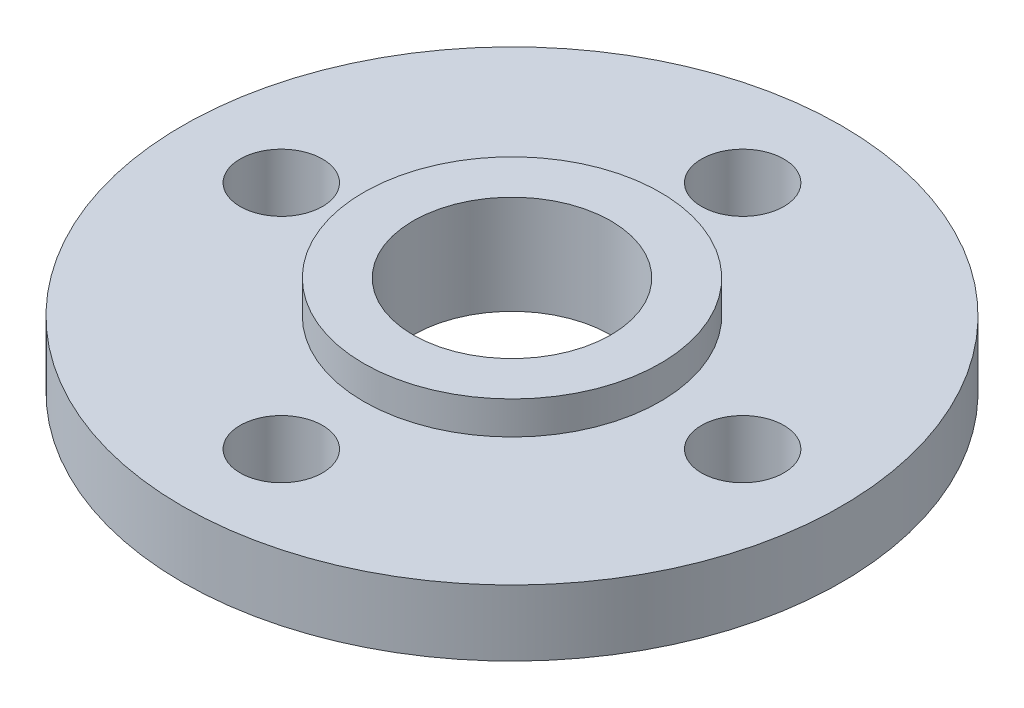
ISO-10303-21;
HEADER;
FILE_DESCRIPTION(('STEP AP214'),'2;1');
FILE_NAME('part.step','',(''),(''),'','','');
FILE_SCHEMA(('AUTOMOTIVE_DESIGN { 1 0 10303 214 1 1 1 1 }'));
ENDSEC;
DATA;
#1=APPLICATION_CONTEXT('core data for automotive mechanical design processes');
#2=APPLICATION_PROTOCOL_DEFINITION('international standard','automotive_design',2000,#1);
#3=PRODUCT_CONTEXT('',#1,'mechanical');
#4=PRODUCT('Part','Part','',(#3));
#5=PRODUCT_RELATED_PRODUCT_CATEGORY('part','',(#4));
#6=PRODUCT_DEFINITION_FORMATION('','',#4);
#7=PRODUCT_DEFINITION_CONTEXT('part definition',#1,'design');
#8=PRODUCT_DEFINITION('design','',#6,#7);
#9=PRODUCT_DEFINITION_SHAPE('','',#8);
#10=(LENGTH_UNIT() NAMED_UNIT(*) SI_UNIT(.MILLI.,.METRE.));
#11=(NAMED_UNIT(*) PLANE_ANGLE_UNIT() SI_UNIT($,.RADIAN.));
#12=(NAMED_UNIT(*) SI_UNIT($,.STERADIAN.) SOLID_ANGLE_UNIT());
#13=UNCERTAINTY_MEASURE_WITH_UNIT(LENGTH_MEASURE(1.E-05),#10,'distance_accuracy_value','');
#14=(GEOMETRIC_REPRESENTATION_CONTEXT(3) GLOBAL_UNCERTAINTY_ASSIGNED_CONTEXT((#13)) GLOBAL_UNIT_ASSIGNED_CONTEXT((#10,
#11,#12)) REPRESENTATION_CONTEXT('',''));
#15=CARTESIAN_POINT('',(0.,0.,0.));
#16=DIRECTION('',(0.,0.,1.));
#17=DIRECTION('',(1.,0.,0.));
#18=AXIS2_PLACEMENT_3D('',#15,#16,#17);
#19=CARTESIAN_POINT('',(0.,2.,0.));
#20=DIRECTION('',(0.,1.,0.));
#21=DIRECTION('',(0.,0.,1.));
#22=AXIS2_PLACEMENT_3D('',#19,#20,#21);
#23=PLANE('',#22);
#24=CARTESIAN_POINT('',(0.,2.,-7.));
#25=DIRECTION('',(0.,1.,0.));
#26=DIRECTION('',(0.,0.,1.));
#27=AXIS2_PLACEMENT_3D('',#24,#25,#26);
#28=CIRCLE('',#27,1.25);
#29=CARTESIAN_POINT('',(0.,2.,-5.75));
#30=VERTEX_POINT('',#29);
#31=EDGE_CURVE('E63',#30,#30,#28,.T.);
#32=ORIENTED_EDGE('',*,*,#31,.F.);
#33=EDGE_LOOP('',(#32));
#34=FACE_BOUND('',#33,.T.);
#35=CARTESIAN_POINT('',(0.,2.,7.));
#36=DIRECTION('',(0.,1.,0.));
#37=DIRECTION('',(0.,0.,1.));
#38=AXIS2_PLACEMENT_3D('',#35,#36,#37);
#39=CIRCLE('',#38,1.25);
#40=CARTESIAN_POINT('',(0.,2.,8.25));
#41=VERTEX_POINT('',#40);
#42=EDGE_CURVE('E53',#41,#41,#39,.T.);
#43=ORIENTED_EDGE('',*,*,#42,.F.);
#44=EDGE_LOOP('',(#43));
#45=FACE_BOUND('',#44,.T.);
#46=CARTESIAN_POINT('',(7.,2.,0.));
#47=DIRECTION('',(0.,1.,0.));
#48=DIRECTION('',(0.,0.,1.));
#49=AXIS2_PLACEMENT_3D('',#46,#47,#48);
#50=CIRCLE('',#49,1.25);
#51=CARTESIAN_POINT('',(7.,2.,1.25));
#52=VERTEX_POINT('',#51);
#53=EDGE_CURVE('E43',#52,#52,#50,.T.);
#54=ORIENTED_EDGE('',*,*,#53,.F.);
#55=EDGE_LOOP('',(#54));
#56=FACE_BOUND('',#55,.T.);
#57=CARTESIAN_POINT('',(0.,2.,0.));
#58=DIRECTION('',(0.,1.,0.));
#59=DIRECTION('',(0.,0.,1.));
#60=AXIS2_PLACEMENT_3D('',#57,#58,#59);
#61=CIRCLE('',#60,10.);
#62=CARTESIAN_POINT('',(0.,2.,10.));
#63=VERTEX_POINT('',#62);
#64=EDGE_CURVE('E10',#63,#63,#61,.T.);
#65=ORIENTED_EDGE('',*,*,#64,.T.);
#66=EDGE_LOOP('',(#65));
#67=FACE_BOUND('',#66,.T.);
#68=CARTESIAN_POINT('',(-7.,2.,0.));
#69=DIRECTION('',(0.,1.,0.));
#70=DIRECTION('',(0.,0.,1.));
#71=AXIS2_PLACEMENT_3D('',#68,#69,#70);
#72=CIRCLE('',#71,1.25);
#73=CARTESIAN_POINT('',(-7.,2.,1.24999999999995));
#74=VERTEX_POINT('',#73);
#75=EDGE_CURVE('E57',#74,#74,#72,.T.);
#76=ORIENTED_EDGE('',*,*,#75,.F.);
#77=EDGE_LOOP('',(#76));
#78=FACE_BOUND('',#77,.T.);
#79=CARTESIAN_POINT('',(0.,2.,0.));
#80=DIRECTION('',(0.,1.,0.));
#81=DIRECTION('',(0.,0.,1.));
#82=AXIS2_PLACEMENT_3D('',#79,#80,#81);
#83=CIRCLE('',#82,4.5);
#84=CARTESIAN_POINT('',(0.,2.,4.5));
#85=VERTEX_POINT('',#84);
#86=EDGE_CURVE('E72',#85,#85,#83,.T.);
#87=ORIENTED_EDGE('',*,*,#86,.F.);
#88=EDGE_LOOP('',(#87));
#89=FACE_BOUND('',#88,.T.);
#90=ADVANCED_FACE('F32',(#34,#45,#56,#67,#78,#89),#23,.T.);
#91=CARTESIAN_POINT('',(0.,0.,0.));
#92=DIRECTION('',(0.,1.,0.));
#93=DIRECTION('',(0.,0.,1.));
#94=AXIS2_PLACEMENT_3D('',#91,#92,#93);
#95=PLANE('',#94);
#96=CARTESIAN_POINT('',(-7.,0.,0.));
#97=DIRECTION('',(0.,1.,0.));
#98=DIRECTION('',(0.,0.,1.));
#99=AXIS2_PLACEMENT_3D('',#96,#97,#98);
#100=CIRCLE('',#99,1.25);
#101=CARTESIAN_POINT('',(-7.,0.,1.24999999999995));
#102=VERTEX_POINT('',#101);
#103=EDGE_CURVE('E60',#102,#102,#100,.T.);
#104=ORIENTED_EDGE('',*,*,#103,.T.);
#105=EDGE_LOOP('',(#104));
#106=FACE_BOUND('',#105,.T.);
#107=CARTESIAN_POINT('',(0.,0.,0.));
#108=DIRECTION('',(0.,1.,0.));
#109=DIRECTION('',(0.,0.,1.));
#110=AXIS2_PLACEMENT_3D('',#107,#108,#109);
#111=CIRCLE('',#110,3.);
#112=CARTESIAN_POINT('',(0.,0.,3.));
#113=VERTEX_POINT('',#112);
#114=EDGE_CURVE('E48',#113,#113,#111,.T.);
#115=ORIENTED_EDGE('',*,*,#114,.T.);
#116=EDGE_LOOP('',(#115));
#117=FACE_BOUND('',#116,.T.);
#118=CARTESIAN_POINT('',(0.,0.,0.));
#119=DIRECTION('',(0.,1.,0.));
#120=DIRECTION('',(0.,0.,1.));
#121=AXIS2_PLACEMENT_3D('',#118,#119,#120);
#122=CIRCLE('',#121,10.);
#123=CARTESIAN_POINT('',(0.,0.,10.));
#124=VERTEX_POINT('',#123);
#125=EDGE_CURVE('E36',#124,#124,#122,.T.);
#126=ORIENTED_EDGE('',*,*,#125,.F.);
#127=EDGE_LOOP('',(#126));
#128=FACE_BOUND('',#127,.T.);
#129=CARTESIAN_POINT('',(7.,0.,0.));
#130=DIRECTION('',(0.,1.,0.));
#131=DIRECTION('',(0.,0.,1.));
#132=AXIS2_PLACEMENT_3D('',#129,#130,#131);
#133=CIRCLE('',#132,1.25);
#134=CARTESIAN_POINT('',(7.,0.,1.25));
#135=VERTEX_POINT('',#134);
#136=EDGE_CURVE('E45',#135,#135,#133,.T.);
#137=ORIENTED_EDGE('',*,*,#136,.T.);
#138=EDGE_LOOP('',(#137));
#139=FACE_BOUND('',#138,.T.);
#140=CARTESIAN_POINT('',(0.,0.,7.));
#141=DIRECTION('',(0.,1.,0.));
#142=DIRECTION('',(0.,0.,1.));
#143=AXIS2_PLACEMENT_3D('',#140,#141,#142);
#144=CIRCLE('',#143,1.25);
#145=CARTESIAN_POINT('',(0.,0.,8.25));
#146=VERTEX_POINT('',#145);
#147=EDGE_CURVE('E54',#146,#146,#144,.T.);
#148=ORIENTED_EDGE('',*,*,#147,.T.);
#149=EDGE_LOOP('',(#148));
#150=FACE_BOUND('',#149,.T.);
#151=CARTESIAN_POINT('',(0.,0.,-7.));
#152=DIRECTION('',(0.,1.,0.));
#153=DIRECTION('',(0.,0.,1.));
#154=AXIS2_PLACEMENT_3D('',#151,#152,#153);
#155=CIRCLE('',#154,1.25);
#156=CARTESIAN_POINT('',(0.,0.,-5.75));
#157=VERTEX_POINT('',#156);
#158=EDGE_CURVE('E66',#157,#157,#155,.T.);
#159=ORIENTED_EDGE('',*,*,#158,.T.);
#160=EDGE_LOOP('',(#159));
#161=FACE_BOUND('',#160,.T.);
#162=ADVANCED_FACE('F99',(#106,#117,#128,#139,#150,#161),#95,.F.);
#163=CARTESIAN_POINT('',(0.,2.,0.));
#164=DIRECTION('',(0.,-1.,0.));
#165=DIRECTION('',(0.,0.,-1.));
#166=AXIS2_PLACEMENT_3D('',#163,#164,#165);
#167=CYLINDRICAL_SURFACE('',#166,10.);
#168=ORIENTED_EDGE('',*,*,#64,.F.);
#169=EDGE_LOOP('',(#168));
#170=FACE_BOUND('',#169,.T.);
#171=ORIENTED_EDGE('',*,*,#125,.T.);
#172=EDGE_LOOP('',(#171));
#173=FACE_BOUND('',#172,.T.);
#174=ADVANCED_FACE('F34',(#170,#173),#167,.T.);
#175=CARTESIAN_POINT('',(7.,2.,0.));
#176=DIRECTION('',(0.,-1.,0.));
#177=DIRECTION('',(0.,0.,-1.));
#178=AXIS2_PLACEMENT_3D('',#175,#176,#177);
#179=CYLINDRICAL_SURFACE('',#178,1.25);
#180=ORIENTED_EDGE('',*,*,#53,.T.);
#181=EDGE_LOOP('',(#180));
#182=FACE_BOUND('',#181,.T.);
#183=ORIENTED_EDGE('',*,*,#136,.F.);
#184=EDGE_LOOP('',(#183));
#185=FACE_BOUND('',#184,.T.);
#186=ADVANCED_FACE('F109',(#182,#185),#179,.F.);
#187=CARTESIAN_POINT('',(0.,2.,0.));
#188=DIRECTION('',(0.,-1.,0.));
#189=DIRECTION('',(0.,0.,-1.));
#190=AXIS2_PLACEMENT_3D('',#187,#188,#189);
#191=CYLINDRICAL_SURFACE('',#190,3.);
#192=ORIENTED_EDGE('',*,*,#114,.F.);
#193=EDGE_LOOP('',(#192));
#194=FACE_BOUND('',#193,.T.);
#195=CARTESIAN_POINT('',(0.,3.,0.));
#196=DIRECTION('',(0.,1.,0.));
#197=DIRECTION('',(0.,0.,1.));
#198=AXIS2_PLACEMENT_3D('',#195,#196,#197);
#199=CIRCLE('',#198,3.);
#200=CARTESIAN_POINT('',(0.,3.,3.));
#201=VERTEX_POINT('',#200);
#202=EDGE_CURVE('E75',#201,#201,#199,.T.);
#203=ORIENTED_EDGE('',*,*,#202,.T.);
#204=EDGE_LOOP('',(#203));
#205=FACE_BOUND('',#204,.T.);
#206=ADVANCED_FACE('F81',(#194,#205),#191,.F.);
#207=CARTESIAN_POINT('',(0.,2.,7.));
#208=DIRECTION('',(0.,-1.,0.));
#209=DIRECTION('',(0.,0.,-1.));
#210=AXIS2_PLACEMENT_3D('',#207,#208,#209);
#211=CYLINDRICAL_SURFACE('',#210,1.25);
#212=ORIENTED_EDGE('',*,*,#42,.T.);
#213=EDGE_LOOP('',(#212));
#214=FACE_BOUND('',#213,.T.);
#215=ORIENTED_EDGE('',*,*,#147,.F.);
#216=EDGE_LOOP('',(#215));
#217=FACE_BOUND('',#216,.T.);
#218=ADVANCED_FACE('F115',(#214,#217),#211,.F.);
#219=CARTESIAN_POINT('',(-7.,2.,0.));
#220=DIRECTION('',(0.,-1.,0.));
#221=DIRECTION('',(0.,0.,-1.));
#222=AXIS2_PLACEMENT_3D('',#219,#220,#221);
#223=CYLINDRICAL_SURFACE('',#222,1.25);
#224=ORIENTED_EDGE('',*,*,#75,.T.);
#225=EDGE_LOOP('',(#224));
#226=FACE_BOUND('',#225,.T.);
#227=ORIENTED_EDGE('',*,*,#103,.F.);
#228=EDGE_LOOP('',(#227));
#229=FACE_BOUND('',#228,.T.);
#230=ADVANCED_FACE('F95',(#226,#229),#223,.F.);
#231=CARTESIAN_POINT('',(0.,2.,-7.));
#232=DIRECTION('',(0.,-1.,0.));
#233=DIRECTION('',(0.,0.,-1.));
#234=AXIS2_PLACEMENT_3D('',#231,#232,#233);
#235=CYLINDRICAL_SURFACE('',#234,1.25);
#236=ORIENTED_EDGE('',*,*,#31,.T.);
#237=EDGE_LOOP('',(#236));
#238=FACE_BOUND('',#237,.T.);
#239=ORIENTED_EDGE('',*,*,#158,.F.);
#240=EDGE_LOOP('',(#239));
#241=FACE_BOUND('',#240,.T.);
#242=ADVANCED_FACE('F86',(#238,#241),#235,.F.);
#243=CARTESIAN_POINT('',(0.,3.,0.));
#244=DIRECTION('',(0.,1.,0.));
#245=DIRECTION('',(0.,0.,1.));
#246=AXIS2_PLACEMENT_3D('',#243,#244,#245);
#247=PLANE('',#246);
#248=CARTESIAN_POINT('',(0.,3.,0.));
#249=DIRECTION('',(0.,1.,0.));
#250=DIRECTION('',(0.,0.,1.));
#251=AXIS2_PLACEMENT_3D('',#248,#249,#250);
#252=CIRCLE('',#251,4.5);
#253=CARTESIAN_POINT('',(0.,3.,4.5));
#254=VERTEX_POINT('',#253);
#255=EDGE_CURVE('E69',#254,#254,#252,.T.);
#256=ORIENTED_EDGE('',*,*,#255,.T.);
#257=EDGE_LOOP('',(#256));
#258=FACE_BOUND('',#257,.T.);
#259=ORIENTED_EDGE('',*,*,#202,.F.);
#260=EDGE_LOOP('',(#259));
#261=FACE_BOUND('',#260,.T.);
#262=ADVANCED_FACE('F83',(#258,#261),#247,.T.);
#263=CARTESIAN_POINT('',(0.,3.,0.));
#264=DIRECTION('',(0.,-1.,0.));
#265=DIRECTION('',(0.,0.,-1.));
#266=AXIS2_PLACEMENT_3D('',#263,#264,#265);
#267=CYLINDRICAL_SURFACE('',#266,4.5);
#268=ORIENTED_EDGE('',*,*,#255,.F.);
#269=EDGE_LOOP('',(#268));
#270=FACE_BOUND('',#269,.T.);
#271=ORIENTED_EDGE('',*,*,#86,.T.);
#272=EDGE_LOOP('',(#271));
#273=FACE_BOUND('',#272,.T.);
#274=ADVANCED_FACE('F85',(#270,#273),#267,.T.);
#275=CLOSED_SHELL('',(#90,#162,#174,#186,#206,#218,#230,#242,#262,#274));
#276=MANIFOLD_SOLID_BREP('B2',#275);
#277=ADVANCED_BREP_SHAPE_REPRESENTATION('',(#18,#276),#14);
#278=SHAPE_DEFINITION_REPRESENTATION(#9,#277);
ENDSEC;
END-ISO-10303-21;
